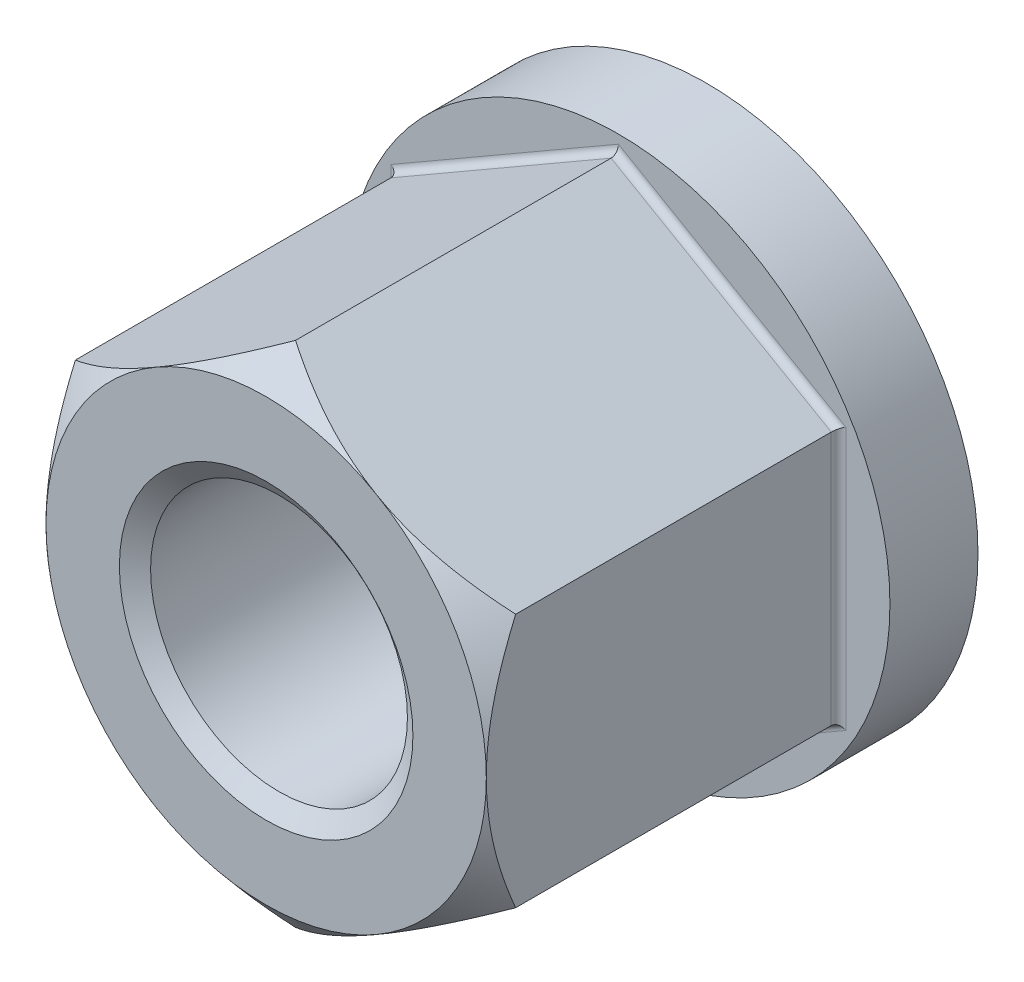
ISO-10303-21;
HEADER;
FILE_DESCRIPTION(('STEP AP214'),'2;1');
FILE_NAME('part.step','',(''),(''),'','','');
FILE_SCHEMA(('AUTOMOTIVE_DESIGN { 1 0 10303 214 1 1 1 1 }'));
ENDSEC;
DATA;
#1=APPLICATION_CONTEXT('core data for automotive mechanical design processes');
#2=APPLICATION_PROTOCOL_DEFINITION('international standard','automotive_design',2000,#1);
#3=PRODUCT_CONTEXT('',#1,'mechanical');
#4=PRODUCT('Part','Part','',(#3));
#5=PRODUCT_RELATED_PRODUCT_CATEGORY('part','',(#4));
#6=PRODUCT_DEFINITION_FORMATION('','',#4);
#7=PRODUCT_DEFINITION_CONTEXT('part definition',#1,'design');
#8=PRODUCT_DEFINITION('design','',#6,#7);
#9=PRODUCT_DEFINITION_SHAPE('','',#8);
#10=(LENGTH_UNIT() NAMED_UNIT(*) SI_UNIT(.MILLI.,.METRE.));
#11=(NAMED_UNIT(*) PLANE_ANGLE_UNIT() SI_UNIT($,.RADIAN.));
#12=(NAMED_UNIT(*) SI_UNIT($,.STERADIAN.) SOLID_ANGLE_UNIT());
#13=UNCERTAINTY_MEASURE_WITH_UNIT(LENGTH_MEASURE(1.E-05),#10,'distance_accuracy_value','');
#14=(GEOMETRIC_REPRESENTATION_CONTEXT(3) GLOBAL_UNCERTAINTY_ASSIGNED_CONTEXT((#13)) GLOBAL_UNIT_ASSIGNED_CONTEXT((#10,
#11,#12)) REPRESENTATION_CONTEXT('',''));
#15=CARTESIAN_POINT('',(0.,0.,0.));
#16=DIRECTION('',(0.,0.,1.));
#17=DIRECTION('',(1.,0.,0.));
#18=AXIS2_PLACEMENT_3D('',#15,#16,#17);
#19=CARTESIAN_POINT('',(0.,0.,-30.));
#20=DIRECTION('',(0.,0.,1.));
#21=DIRECTION('',(1.,0.,0.));
#22=AXIS2_PLACEMENT_3D('',#19,#20,#21);
#23=CYLINDRICAL_SURFACE('',#22,8.75);
#24=CARTESIAN_POINT('',(0.,0.,-0.875259422762136));
#25=DIRECTION('',(0.,0.,1.));
#26=DIRECTION('',(1.,0.,0.));
#27=AXIS2_PLACEMENT_3D('',#24,#25,#26);
#28=CIRCLE('',#27,8.75);
#29=CARTESIAN_POINT('',(8.75,0.,-0.875259422762136));
#30=VERTEX_POINT('',#29);
#31=EDGE_CURVE('E311',#30,#30,#28,.F.);
#32=ORIENTED_EDGE('',*,*,#31,.F.);
#33=EDGE_LOOP('',(#32));
#34=FACE_BOUND('',#33,.T.);
#35=CARTESIAN_POINT('',(0.,0.,-29.0993405772379));
#36=DIRECTION('',(0.,0.,-1.));
#37=DIRECTION('',(-1.,0.,0.));
#38=AXIS2_PLACEMENT_3D('',#35,#36,#37);
#39=CIRCLE('',#38,8.75);
#40=CARTESIAN_POINT('',(-8.75,0.,-29.0993405772379));
#41=VERTEX_POINT('',#40);
#42=EDGE_CURVE('E315',#41,#41,#39,.F.);
#43=ORIENTED_EDGE('',*,*,#42,.F.);
#44=EDGE_LOOP('',(#43));
#45=FACE_BOUND('',#44,.T.);
#46=ADVANCED_FACE('F36',(#34,#45),#23,.F.);
#47=CARTESIAN_POINT('',(0.,17.3205080756888,-30.));
#48=DIRECTION('',(-0.500000000000001,0.866025403784438,0.));
#49=DIRECTION('',(-0.866025403784438,-0.500000000000001,0.));
#50=AXIS2_PLACEMENT_3D('',#47,#48,#49);
#51=PLANE('',#50);
#52=DIRECTION('',(0.,0.,1.));
#53=VECTOR('',#52,1.);
#54=CARTESIAN_POINT('',(0.,17.3205080756888,-30.));
#55=LINE('',#54,#53);
#56=CARTESIAN_POINT('',(0.,17.3205080756888,-23.5));
#57=VERTEX_POINT('',#56);
#58=CARTESIAN_POINT('',(0.,17.3205080756888,-2.));
#59=VERTEX_POINT('',#58);
#60=EDGE_CURVE('E136',#57,#59,#55,.T.);
#61=ORIENTED_EDGE('',*,*,#60,.F.);
#62=DIRECTION('',(-0.866025403784438,-0.500000000000001,0.));
#63=VECTOR('',#62,1.);
#64=CARTESIAN_POINT('',(0.,17.3205080756888,-23.5));
#65=LINE('',#64,#63);
#66=CARTESIAN_POINT('',(-15.,8.66025403784438,-23.5));
#67=VERTEX_POINT('',#66);
#68=EDGE_CURVE('E291',#57,#67,#65,.T.);
#69=ORIENTED_EDGE('',*,*,#68,.T.);
#70=DIRECTION('',(0.,0.,1.));
#71=VECTOR('',#70,1.);
#72=CARTESIAN_POINT('',(-15.,8.66025403784438,-30.));
#73=LINE('',#72,#71);
#74=CARTESIAN_POINT('',(-15.,8.66025403784438,-1.99999999999999));
#75=VERTEX_POINT('',#74);
#76=EDGE_CURVE('E397',#67,#75,#73,.T.);
#77=ORIENTED_EDGE('',*,*,#76,.T.);
#78=CARTESIAN_POINT('',(-15.0002,8.66013856779054,-2.00009952235006));
#79=CARTESIAN_POINT('',(-14.7060757976467,8.82995125519442,-1.85376357380572));
#80=CARTESIAN_POINT('',(-14.4098812995456,9.00095922840558,-1.71280448699444));
#81=CARTESIAN_POINT('',(-13.8130701074498,9.34552833081745,-1.44337970687907));
#82=CARTESIAN_POINT('',(-13.5124509184251,9.51909090052444,-1.31492139968357));
#83=CARTESIAN_POINT('',(-12.9053171881535,9.86961972313082,-1.07179862141888));
#84=CARTESIAN_POINT('',(-12.5987804698595,10.0465987799544,-0.95720746667837));
#85=CARTESIAN_POINT('',(-11.9814441021399,10.4030180980378,-0.744650765460598));
#86=CARTESIAN_POINT('',(-11.6706451758392,10.5824579418014,-0.646682435571173));
#87=CARTESIAN_POINT('',(-11.0506469286094,10.9404140967366,-0.471023182345309));
#88=CARTESIAN_POINT('',(-10.7415185231247,11.1188894648574,-0.393000744560478));
#89=CARTESIAN_POINT('',(-10.1199547642437,11.4777494683658,-0.25686594504551));
#90=CARTESIAN_POINT('',(-9.80751931264454,11.658134160451,-0.198754176283631));
#91=CARTESIAN_POINT('',(-9.18088543175198,12.0199214002677,-0.104143857271192));
#92=CARTESIAN_POINT('',(-8.86669240865014,12.201320826733,-0.0675979340687058));
#93=CARTESIAN_POINT('',(-8.23695394550474,12.5649004979491,-0.0170214367027407));
#94=CARTESIAN_POINT('',(-7.9214086044632,12.7470806855409,-0.00298924163594202));
#95=CARTESIAN_POINT('',(-7.33426455441391,13.08606846089,0.00177413708507495));
#96=CARTESIAN_POINT('',(-7.06268097278657,13.24286731485,-0.00451502163640773));
#97=CARTESIAN_POINT('',(-6.52020787540679,13.5560643036503,-0.0339193309163509));
#98=CARTESIAN_POINT('',(-6.24931833664911,13.7124624517727,-0.0570339163329606));
#99=CARTESIAN_POINT('',(-5.70876115134929,14.024553288218,-0.119589923967057));
#100=CARTESIAN_POINT('',(-5.43909455801071,14.1802453684735,-0.159043422054258));
#101=CARTESIAN_POINT('',(-4.90182180864681,14.490439934947,-0.253419775039468));
#102=CARTESIAN_POINT('',(-4.63421568232431,14.644942404016,-0.308342852513073));
#103=CARTESIAN_POINT('',(-3.83513389890789,15.106292486776,-0.49476628021808));
#104=CARTESIAN_POINT('',(-3.30738818721074,15.4109866154881,-0.647921641084802));
#105=CARTESIAN_POINT('',(-2.26451509299679,16.0130896771631,-1.00192343949661));
#106=CARTESIAN_POINT('',(-1.74938365522976,16.3105009514259,-1.2027543221892));
#107=CARTESIAN_POINT('',(-1.03142392231063,16.7250151964941,-1.51292629823482));
#108=CARTESIAN_POINT('',(-0.823357044658433,16.8451426643161,-1.60648338502438));
#109=CARTESIAN_POINT('',(-0.409806250301163,17.0839063267618,-1.79919445620714));
#110=CARTESIAN_POINT('',(-0.204317005560418,17.2025455975285,-1.89833317959749));
#111=CARTESIAN_POINT('',(0.000200000000003288,17.3206235457426,-2.00009952235005));
#112=B_SPLINE_CURVE_WITH_KNOTS('',3,(#78,#79,#80,#81,#82,#83,#84,#85,#86,#87,#88,#89,#90,#91,
#92,#93,#94,#95,#96,#97,#98,#99,#100,#101,#102,#103,#104,#105,#106,#107,#108,#109,#110,#111),
.UNSPECIFIED.,.F.,.F.,(4,2,2,2,2,2,2,2,2,2,2,2,2,2,2,2,4),(0.,1.10948507069864,2.21962175239093,
3.33539267821336,4.45097658878426,5.54659561152164,6.64224726052818,7.73548308250292,
8.82864019209861,9.7691757573931,10.7096797329101,11.6508800662861,12.592093942301,
14.4744986262021,16.3562899894552,17.1297186672474,17.9011266906692),.UNSPECIFIED.);
#113=CARTESIAN_POINT('',(-7.50000000000001,12.9903810567666,0.));
#114=VERTEX_POINT('',#113);
#115=EDGE_CURVE('E146',#75,#114,#112,.T.);
#116=ORIENTED_EDGE('',*,*,#115,.T.);
#117=EDGE_CURVE('E154',#114,#59,#112,.T.);
#118=ORIENTED_EDGE('',*,*,#117,.T.);
#119=EDGE_LOOP('',(#61,#69,#77,#116,#118));
#120=FACE_BOUND('',#119,.T.);
#121=ADVANCED_FACE('F225',(#120),#51,.T.);
#122=CARTESIAN_POINT('',(15.,8.66025403784439,-30.));
#123=DIRECTION('',(0.5,0.866025403784438,0.));
#124=DIRECTION('',(-0.866025403784439,0.5,0.));
#125=AXIS2_PLACEMENT_3D('',#122,#123,#124);
#126=PLANE('',#125);
#127=DIRECTION('',(0.,0.,1.));
#128=VECTOR('',#127,1.);
#129=CARTESIAN_POINT('',(15.,8.66025403784439,-30.));
#130=LINE('',#129,#128);
#131=CARTESIAN_POINT('',(15.,8.66025403784439,-23.5));
#132=VERTEX_POINT('',#131);
#133=CARTESIAN_POINT('',(15.,8.6602540378444,-2.));
#134=VERTEX_POINT('',#133);
#135=EDGE_CURVE('E125',#132,#134,#130,.T.);
#136=ORIENTED_EDGE('',*,*,#135,.F.);
#137=DIRECTION('',(-0.866025403784439,0.5,0.));
#138=VECTOR('',#137,1.);
#139=CARTESIAN_POINT('',(15.,8.66025403784439,-23.5));
#140=LINE('',#139,#138);
#141=EDGE_CURVE('E344',#132,#57,#140,.T.);
#142=ORIENTED_EDGE('',*,*,#141,.T.);
#143=ORIENTED_EDGE('',*,*,#60,.T.);
#144=CARTESIAN_POINT('',(-0.00020000000000316,17.3206235457426,-2.00009952235007));
#145=CARTESIAN_POINT('',(0.293924202353319,17.1508108583387,-1.85376357380573));
#146=CARTESIAN_POINT('',(0.590118700454435,16.9798028851276,-1.71280448699445));
#147=CARTESIAN_POINT('',(1.18692989255019,16.6352337827157,-1.44337970687908));
#148=CARTESIAN_POINT('',(1.48754908157492,16.4616712130087,-1.31492139968358));
#149=CARTESIAN_POINT('',(2.09468281184647,16.1111423904023,-1.07179862141888));
#150=CARTESIAN_POINT('',(2.40121953014046,15.9341633335788,-0.957207466678374));
#151=CARTESIAN_POINT('',(3.0185558978601,15.5777440154953,-0.744650765460601));
#152=CARTESIAN_POINT('',(3.32935482416082,15.3983041717318,-0.646682435571175));
#153=CARTESIAN_POINT('',(3.94935307139059,15.0403480167965,-0.471023182345312));
#154=CARTESIAN_POINT('',(4.25848147687533,14.8618726486758,-0.393000744560482));
#155=CARTESIAN_POINT('',(4.88004523575629,14.5030126451673,-0.256865945045512));
#156=CARTESIAN_POINT('',(5.19248068735547,14.3226279530822,-0.198754176283632));
#157=CARTESIAN_POINT('',(5.81911456824804,13.9608407132655,-0.104143857271192));
#158=CARTESIAN_POINT('',(6.13330759134988,13.7794412868002,-0.0675979340687059));
#159=CARTESIAN_POINT('',(6.76304605449528,13.4158616155841,-0.0170214367027422));
#160=CARTESIAN_POINT('',(7.07859139553682,13.2336814279922,-0.00298924163594429));
#161=CARTESIAN_POINT('',(7.66573544558611,12.8946936526432,0.00177413708507411));
#162=CARTESIAN_POINT('',(7.93731902721345,12.7378947986832,-0.00451502163640669));
#163=CARTESIAN_POINT('',(8.47979212459323,12.4246978098828,-0.0339193309163505));
#164=CARTESIAN_POINT('',(8.75068166335091,12.2682996617604,-0.0570339163329628));
#165=CARTESIAN_POINT('',(9.29123884865073,11.9562088253152,-0.11958992396706));
#166=CARTESIAN_POINT('',(9.56090544198932,11.8005167450597,-0.159043422054259));
#167=CARTESIAN_POINT('',(10.0981781913532,11.4903221785862,-0.253419775039469));
#168=CARTESIAN_POINT('',(10.3657843176757,11.3358197095171,-0.308342852513076));
#169=CARTESIAN_POINT('',(11.1648661010921,10.8744696267571,-0.494766280218087));
#170=CARTESIAN_POINT('',(11.6926118127893,10.5697754980451,-0.647921641084808));
#171=CARTESIAN_POINT('',(12.7354849070032,9.96767243637004,-1.00192343949662));
#172=CARTESIAN_POINT('',(13.2506163447703,9.67026116210721,-1.20275432218921));
#173=CARTESIAN_POINT('',(13.9685760776894,9.25574691703904,-1.51292629823483));
#174=CARTESIAN_POINT('',(14.1766429553416,9.1356194492171,-1.60648338502438));
#175=CARTESIAN_POINT('',(14.5901937496988,8.89685578677135,-1.79919445620714));
#176=CARTESIAN_POINT('',(14.7956829944396,8.77821651600471,-1.89833317959748));
#177=CARTESIAN_POINT('',(15.0002,8.66013856779055,-2.00009952235005));
#178=B_SPLINE_CURVE_WITH_KNOTS('',3,(#144,#145,#146,#147,#148,#149,#150,#151,#152,#153,#154,
#155,#156,#157,#158,#159,#160,#161,#162,#163,#164,#165,#166,#167,#168,#169,#170,#171,#172,#173,
#174,#175,#176,#177),.UNSPECIFIED.,.F.,.F.,(4,2,2,2,2,2,2,2,2,2,2,2,2,2,2,2,4),(0.,
1.10948507069864,2.21962175239093,3.33539267821337,4.45097658878428,5.54659561152165,
6.6422472605282,7.73548308250295,8.82864019209864,9.76917575739312,10.7096797329102,
11.6508800662862,12.592093942301,14.4744986262022,16.3562899894552,17.1297186672474,
17.9011266906692),.UNSPECIFIED.);
#179=CARTESIAN_POINT('',(7.50000000000001,12.9903810567666,0.));
#180=VERTEX_POINT('',#179);
#181=EDGE_CURVE('E152',#59,#180,#178,.T.);
#182=ORIENTED_EDGE('',*,*,#181,.T.);
#183=EDGE_CURVE('E141',#180,#134,#178,.T.);
#184=ORIENTED_EDGE('',*,*,#183,.T.);
#185=EDGE_LOOP('',(#136,#142,#143,#182,#184));
#186=FACE_BOUND('',#185,.T.);
#187=ADVANCED_FACE('F150',(#186),#126,.T.);
#188=CARTESIAN_POINT('',(15.,8.66025403784439,-30.));
#189=DIRECTION('',(-1.,0.,0.));
#190=DIRECTION('',(0.,0.,1.));
#191=AXIS2_PLACEMENT_3D('',#188,#189,#190);
#192=PLANE('',#191);
#193=DIRECTION('',(0.,0.,1.));
#194=VECTOR('',#193,1.);
#195=CARTESIAN_POINT('',(15.,-8.66025403784439,-30.));
#196=LINE('',#195,#194);
#197=CARTESIAN_POINT('',(15.,-8.66025403784439,-23.5));
#198=VERTEX_POINT('',#197);
#199=CARTESIAN_POINT('',(15.,-8.66025403784439,-2.));
#200=VERTEX_POINT('',#199);
#201=EDGE_CURVE('E137',#198,#200,#196,.T.);
#202=ORIENTED_EDGE('',*,*,#201,.F.);
#203=DIRECTION('',(0.,-1.,0.));
#204=VECTOR('',#203,1.);
#205=CARTESIAN_POINT('',(15.,8.66025403784439,-23.5));
#206=LINE('',#205,#204);
#207=EDGE_CURVE('E132',#198,#132,#206,.F.);
#208=ORIENTED_EDGE('',*,*,#207,.T.);
#209=ORIENTED_EDGE('',*,*,#135,.T.);
#210=CARTESIAN_POINT('',(15.,-19.1700059350074,-8.05090889611689));
#211=CARTESIAN_POINT('',(15.,-18.9275206354568,-7.88631767771326));
#212=CARTESIAN_POINT('',(15.,-18.6844874388706,-7.72253420345206));
#213=CARTESIAN_POINT('',(15.,-18.1972287099045,-7.39674277064008));
#214=CARTESIAN_POINT('',(15.,-17.9530031591107,-7.23473483963597));
#215=CARTESIAN_POINT('',(15.,-17.2183033754217,-6.75155555270782));
#216=CARTESIAN_POINT('',(15.,-16.7259060298545,-6.43329677874288));
#217=CARTESIAN_POINT('',(15.,-15.7316332205885,-5.80395780434216));
#218=CARTESIAN_POINT('',(15.,-15.2297153036346,-5.49294452298561));
#219=CARTESIAN_POINT('',(15.,-14.2188386651143,-4.88261437731177));
#220=CARTESIAN_POINT('',(15.,-13.7098803898837,-4.58329677608631));
#221=CARTESIAN_POINT('',(15.,-12.6558737691412,-3.98324168268048));
#222=CARTESIAN_POINT('',(15.,-12.1103654113884,-3.68330803620537));
#223=CARTESIAN_POINT('',(15.,-11.0085509125241,-3.10364215180241));
#224=CARTESIAN_POINT('',(15.,-10.4522432037346,-2.82391287507046));
#225=CARTESIAN_POINT('',(15.,-9.32882395666249,-2.29094315775273));
#226=CARTESIAN_POINT('',(15.,-8.76174593243296,-2.03763271569057));
#227=CARTESIAN_POINT('',(15.,-7.61420990037534,-1.5637598276153));
#228=CARTESIAN_POINT('',(15.,-7.03375753033514,-1.34318386434149));
#229=CARTESIAN_POINT('',(15.,-5.87502682424205,-0.948900988874816));
#230=CARTESIAN_POINT('',(15.,-5.29714569425346,-0.774051264481811));
#231=CARTESIAN_POINT('',(15.,-4.42105396009466,-0.547701421247556));
#232=CARTESIAN_POINT('',(15.,-4.12743813987391,-0.478231983515909));
#233=CARTESIAN_POINT('',(15.,-3.53743452890364,-0.352355791219994));
#234=CARTESIAN_POINT('',(15.,-3.241047120842,-0.295947260184663));
#235=CARTESIAN_POINT('',(15.,-2.65145129592594,-0.198095868457253));
#236=CARTESIAN_POINT('',(15.,-2.35828586612642,-0.156394854813077));
#237=CARTESIAN_POINT('',(15.,-1.77026502501334,-0.0873015611666262));
#238=CARTESIAN_POINT('',(15.,-1.47540962715372,-0.059909167411891));
#239=CARTESIAN_POINT('',(15.,-0.8847145680178,-0.019981298888571));
#240=CARTESIAN_POINT('',(15.,-0.588874992642845,-0.00744455992000842));
#241=CARTESIAN_POINT('',(15.,0.00305761451050969,0.00251533349846376));
#242=CARTESIAN_POINT('',(15.,0.299150642562203,-6.12935193820835E-05));
#243=CARTESIAN_POINT('',(15.,0.871019721411166,-0.0195951804328308));
#244=CARTESIAN_POINT('',(15.,1.1468296728535,-0.0355787614535354));
#245=CARTESIAN_POINT('',(15.,1.69743098913966,-0.0803688454583632));
#246=CARTESIAN_POINT('',(15.,1.97222224292503,-0.109176707364896));
#247=CARTESIAN_POINT('',(15.,2.52020530468539,-0.17912243801867));
#248=CARTESIAN_POINT('',(15.,2.79339723606099,-0.220259342348629));
#249=CARTESIAN_POINT('',(15.,3.33777776420506,-0.31420359695824));
#250=CARTESIAN_POINT('',(15.,3.60896609343915,-0.367012477660287));
#251=CARTESIAN_POINT('',(15.,4.43016208456759,-0.544224168870411));
#252=CARTESIAN_POINT('',(15.,4.97652212658976,-0.685926010872227));
#253=CARTESIAN_POINT('',(15.,5.78718186080952,-0.927093948765585));
#254=CARTESIAN_POINT('',(15.,6.05591252895641,-1.01224899932063));
#255=CARTESIAN_POINT('',(15.,6.59047935461385,-1.19122104168167));
#256=CARTESIAN_POINT('',(15.,6.85631559032146,-1.2850377988274));
#257=CARTESIAN_POINT('',(15.,7.60466136813906,-1.56163041477181));
#258=CARTESIAN_POINT('',(15.,8.08378529907564,-1.75358524293515));
#259=CARTESIAN_POINT('',(15.,9.03291639131406,-2.15897509786146));
#260=CARTESIAN_POINT('',(15.,9.50292094886758,-2.37241615474783));
#261=CARTESIAN_POINT('',(15.,10.435035222969,-2.8170801317684));
#262=CARTESIAN_POINT('',(15.,10.8971356874867,-3.04832235174882));
#263=CARTESIAN_POINT('',(15.,11.8137759437364,-3.52517366349231));
#264=CARTESIAN_POINT('',(15.,12.2683163766357,-3.77078152884087));
#265=CARTESIAN_POINT('',(15.,13.1735034135425,-4.2753519445037));
#266=CARTESIAN_POINT('',(15.,13.624109897057,-4.53438621842229));
#267=CARTESIAN_POINT('',(15.,14.5194712634897,-5.06236644462512));
#268=CARTESIAN_POINT('',(15.,14.9642260429993,-5.33131257174866));
#269=CARTESIAN_POINT('',(15.,15.8483804209955,-5.87730627266098));
#270=CARTESIAN_POINT('',(15.,16.2877828704418,-6.15434923994196));
#271=CARTESIAN_POINT('',(15.,17.1621286796864,-6.71536083077432));
#272=CARTESIAN_POINT('',(15.,17.597072077789,-6.99932939476223));
#273=CARTESIAN_POINT('',(15.,18.8105434643133,-7.80331547355916));
#274=CARTESIAN_POINT('',(15.,19.5847195402707,-8.32990192265516));
#275=CARTESIAN_POINT('',(15.,21.1232503196596,-9.39738828495241));
#276=CARTESIAN_POINT('',(15.,21.887603619625,-9.93829021048408));
#277=CARTESIAN_POINT('',(15.,23.3983470976215,-11.0238654907992));
#278=CARTESIAN_POINT('',(15.,24.1448411676302,-11.568394489411));
#279=CARTESIAN_POINT('',(15.,25.2598036920299,-12.3914414497286));
#280=CARTESIAN_POINT('',(15.,25.6306142866812,-12.6667970407769));
#281=CARTESIAN_POINT('',(15.,26.3708177650263,-13.2193998836579));
#282=CARTESIAN_POINT('',(15.,26.7402106628407,-13.4966471165723));
#283=CARTESIAN_POINT('',(15.,27.1089697385117,-13.7747353492357));
#284=B_SPLINE_CURVE_WITH_KNOTS('',3,(#210,#211,#212,#213,#214,#215,#216,#217,#218,#219,#220,
#221,#222,#223,#224,#225,#226,#227,#228,#229,#230,#231,#232,#233,#234,#235,#236,#237,#238,#239,
#240,#241,#242,#243,#244,#245,#246,#247,#248,#249,#250,#251,#252,#253,#254,#255,#256,#257,#258,
#259,#260,#261,#262,#263,#264,#265,#266,#267,#268,#269,#270,#271,#272,#273,#274,#275,#276,#277,
#278,#279,#280,#281,#282,#283),.UNSPECIFIED.,.F.,.F.,(4,2,2,2,2,2,2,2,2,2,2,2,2,2,2,2,2,2,2,2,2,
2,2,2,2,2,2,2,2,2,2,2,2,2,2,2,4),(0.,0.879203745196034,1.75842111155174,3.51721877017545,
5.28849002407527,7.05964949517006,8.926892336207,10.7944082913819,12.6568430031059,
14.5185064947588,16.3278593564779,17.2327799755418,18.137577439996,19.0255944198823,
19.9136043399924,20.8015386860011,21.6894601929238,22.517974772915,23.3465771671968,
24.1751147624484,25.003761059558,26.6950771653709,27.5406764233947,28.3862527794239,
29.9339956822136,31.4821741774755,33.0320554956247,34.5818046908974,36.1409175753303,
37.7000579747798,39.2583279729673,40.8165845740081,43.6252202356825,46.4342528272958,
49.2061553997078,50.591752078976,51.9773349212113),.UNSPECIFIED.);
#285=CARTESIAN_POINT('',(15.,0.,0.));
#286=VERTEX_POINT('',#285);
#287=EDGE_CURVE('E130',#286,#134,#284,.T.);
#288=ORIENTED_EDGE('',*,*,#287,.F.);
#289=EDGE_CURVE('E148',#200,#286,#284,.T.);
#290=ORIENTED_EDGE('',*,*,#289,.F.);
#291=EDGE_LOOP('',(#202,#208,#209,#288,#290));
#292=FACE_BOUND('',#291,.T.);
#293=ADVANCED_FACE('F128',(#292),#192,.F.);
#294=CARTESIAN_POINT('',(0.,-17.3205080756888,-30.));
#295=DIRECTION('',(0.500000000000001,-0.866025403784438,0.));
#296=DIRECTION('',(0.866025403784438,0.500000000000001,0.));
#297=AXIS2_PLACEMENT_3D('',#294,#295,#296);
#298=PLANE('',#297);
#299=DIRECTION('',(0.,0.,1.));
#300=VECTOR('',#299,1.);
#301=CARTESIAN_POINT('',(0.,-17.3205080756888,-30.));
#302=LINE('',#301,#300);
#303=CARTESIAN_POINT('',(0.,-17.3205080756888,-23.5));
#304=VERTEX_POINT('',#303);
#305=CARTESIAN_POINT('',(0.,-17.3205080756888,-2.));
#306=VERTEX_POINT('',#305);
#307=EDGE_CURVE('E306',#304,#306,#302,.T.);
#308=ORIENTED_EDGE('',*,*,#307,.F.);
#309=DIRECTION('',(0.866025403784438,0.500000000000001,0.));
#310=VECTOR('',#309,1.);
#311=CARTESIAN_POINT('',(0.,-17.3205080756888,-23.5));
#312=LINE('',#311,#310);
#313=EDGE_CURVE('E341',#304,#198,#312,.T.);
#314=ORIENTED_EDGE('',*,*,#313,.T.);
#315=ORIENTED_EDGE('',*,*,#201,.T.);
#316=CARTESIAN_POINT('',(15.0002,-8.66013856779056,-2.00009952235007));
#317=CARTESIAN_POINT('',(14.7060757976467,-8.82995125519443,-1.85376357380573));
#318=CARTESIAN_POINT('',(14.4098812995456,-9.00095922840559,-1.71280448699445));
#319=CARTESIAN_POINT('',(13.8130701074498,-9.34552833081746,-1.44337970687908));
#320=CARTESIAN_POINT('',(13.5124509184251,-9.51909090052446,-1.31492139968358));
#321=CARTESIAN_POINT('',(12.9053171881535,-9.86961972313083,-1.07179862141889));
#322=CARTESIAN_POINT('',(12.5987804698596,-10.0465987799544,-0.957207466678381));
#323=CARTESIAN_POINT('',(11.9814441021399,-10.4030180980379,-0.744650765460608));
#324=CARTESIAN_POINT('',(11.6706451758392,-10.5824579418014,-0.646682435571182));
#325=CARTESIAN_POINT('',(11.0506469286094,-10.9404140967366,-0.471023182345318));
#326=CARTESIAN_POINT('',(10.7415185231247,-11.1188894648574,-0.393000744560489));
#327=CARTESIAN_POINT('',(10.1199547642437,-11.4777494683658,-0.256865945045522));
#328=CARTESIAN_POINT('',(9.80751931264455,-11.658134160451,-0.198754176283643));
#329=CARTESIAN_POINT('',(9.18088543175198,-12.0199214002677,-0.104143857271203));
#330=CARTESIAN_POINT('',(8.86669240865015,-12.201320826733,-0.067597934068717));
#331=CARTESIAN_POINT('',(8.23695394550474,-12.5649004979491,-0.0170214367027534));
#332=CARTESIAN_POINT('',(7.9214086044632,-12.7470806855409,-0.00298924163595622));
#333=CARTESIAN_POINT('',(7.33426455441392,-13.08606846089,0.00177413708506144));
#334=CARTESIAN_POINT('',(7.06268097278658,-13.24286731485,-0.00451502163641958));
#335=CARTESIAN_POINT('',(6.52020787540679,-13.5560643036504,-0.0339193309163629));
#336=CARTESIAN_POINT('',(6.24931833664912,-13.7124624517728,-0.0570339163329745));
#337=CARTESIAN_POINT('',(5.7087611513493,-14.024553288218,-0.119589923967071));
#338=CARTESIAN_POINT('',(5.43909455801071,-14.1802453684735,-0.159043422054269));
#339=CARTESIAN_POINT('',(4.90182180864681,-14.490439934947,-0.25341977503948));
#340=CARTESIAN_POINT('',(4.63421568232432,-14.6449424040161,-0.308342852513087));
#341=CARTESIAN_POINT('',(3.8351338989079,-15.1062924867761,-0.494766280218097));
#342=CARTESIAN_POINT('',(3.30738818721075,-15.4109866154881,-0.647921641084818));
#343=CARTESIAN_POINT('',(2.2645150929968,-16.0130896771631,-1.00192343949662));
#344=CARTESIAN_POINT('',(1.74938365522976,-16.310500951426,-1.20275432218922));
#345=CARTESIAN_POINT('',(1.03142392231063,-16.7250151964941,-1.51292629823484));
#346=CARTESIAN_POINT('',(0.823357044658436,-16.8451426643161,-1.60648338502439));
#347=CARTESIAN_POINT('',(0.409806250301165,-17.0839063267618,-1.79919445620716));
#348=CARTESIAN_POINT('',(0.204317005560418,-17.2025455975285,-1.89833317959751));
#349=CARTESIAN_POINT('',(-0.00020000000000472,-17.3206235457426,-2.00009952235007));
#350=B_SPLINE_CURVE_WITH_KNOTS('',3,(#316,#317,#318,#319,#320,#321,#322,#323,#324,#325,#326,
#327,#328,#329,#330,#331,#332,#333,#334,#335,#336,#337,#338,#339,#340,#341,#342,#343,#344,#345,
#346,#347,#348,#349),.UNSPECIFIED.,.F.,.F.,(4,2,2,2,2,2,2,2,2,2,2,2,2,2,2,2,4),(0.,
1.10948507069863,2.21962175239092,3.33539267821335,4.45097658878426,5.54659561152163,
6.64224726052817,7.73548308250292,8.82864019209861,9.76917575739309,10.7096797329101,
11.6508800662861,12.592093942301,14.4744986262021,16.3562899894552,17.1297186672474,
17.9011266906692),.UNSPECIFIED.);
#351=CARTESIAN_POINT('',(7.50000000000002,-12.9903810567666,0.));
#352=VERTEX_POINT('',#351);
#353=EDGE_CURVE('E211',#200,#352,#350,.T.);
#354=ORIENTED_EDGE('',*,*,#353,.T.);
#355=EDGE_CURVE('E203',#352,#306,#350,.T.);
#356=ORIENTED_EDGE('',*,*,#355,.T.);
#357=EDGE_LOOP('',(#308,#314,#315,#354,#356));
#358=FACE_BOUND('',#357,.T.);
#359=ADVANCED_FACE('F214',(#358),#298,.T.);
#360=CARTESIAN_POINT('',(-15.,-8.6602540378444,-30.));
#361=DIRECTION('',(-0.500000000000001,-0.866025403784438,0.));
#362=DIRECTION('',(0.866025403784438,-0.500000000000001,0.));
#363=AXIS2_PLACEMENT_3D('',#360,#361,#362);
#364=PLANE('',#363);
#365=DIRECTION('',(0.,0.,1.));
#366=VECTOR('',#365,1.);
#367=CARTESIAN_POINT('',(-15.,-8.6602540378444,-30.));
#368=LINE('',#367,#366);
#369=CARTESIAN_POINT('',(-15.,-8.6602540378444,-23.5));
#370=VERTEX_POINT('',#369);
#371=CARTESIAN_POINT('',(-15.,-8.6602540378444,-2.));
#372=VERTEX_POINT('',#371);
#373=EDGE_CURVE('E400',#370,#372,#368,.T.);
#374=ORIENTED_EDGE('',*,*,#373,.F.);
#375=DIRECTION('',(0.866025403784438,-0.500000000000001,0.));
#376=VECTOR('',#375,1.);
#377=CARTESIAN_POINT('',(-15.,-8.6602540378444,-23.5));
#378=LINE('',#377,#376);
#379=EDGE_CURVE('E45',#370,#304,#378,.T.);
#380=ORIENTED_EDGE('',*,*,#379,.T.);
#381=ORIENTED_EDGE('',*,*,#307,.T.);
#382=CARTESIAN_POINT('',(0.000200000000001502,-17.3206235457426,-2.00009952235009));
#383=CARTESIAN_POINT('',(-0.293924202353319,-17.1508108583388,-1.85376357380575));
#384=CARTESIAN_POINT('',(-0.590118700454435,-16.9798028851276,-1.71280448699447));
#385=CARTESIAN_POINT('',(-1.18692989255019,-16.6352337827157,-1.4433797068791));
#386=CARTESIAN_POINT('',(-1.48754908157492,-16.4616712130087,-1.3149213996836));
#387=CARTESIAN_POINT('',(-2.09468281184647,-16.1111423904024,-1.0717986214189));
#388=CARTESIAN_POINT('',(-2.40121953014046,-15.9341633335788,-0.957207466678391));
#389=CARTESIAN_POINT('',(-3.0185558978601,-15.5777440154953,-0.744650765460618));
#390=CARTESIAN_POINT('',(-3.32935482416082,-15.3983041717318,-0.646682435571191));
#391=CARTESIAN_POINT('',(-3.94935307139059,-15.0403480167966,-0.471023182345327));
#392=CARTESIAN_POINT('',(-4.25848147687533,-14.8618726486758,-0.393000744560496));
#393=CARTESIAN_POINT('',(-4.88004523575629,-14.5030126451673,-0.256865945045526));
#394=CARTESIAN_POINT('',(-5.19248068735548,-14.3226279530822,-0.198754176283645));
#395=CARTESIAN_POINT('',(-5.81911456824804,-13.9608407132655,-0.104143857271205));
#396=CARTESIAN_POINT('',(-6.13330759134988,-13.7794412868002,-0.0675979340687199));
#397=CARTESIAN_POINT('',(-6.76304605449529,-13.4158616155841,-0.0170214367027566));
#398=CARTESIAN_POINT('',(-7.07859139553683,-13.2336814279922,-0.00298924163595856));
#399=CARTESIAN_POINT('',(-7.66573544558612,-12.8946936526432,0.00177413708506067));
#400=CARTESIAN_POINT('',(-7.93731902721346,-12.7378947986832,-0.00451502163641957));
#401=CARTESIAN_POINT('',(-8.47979212459325,-12.4246978098828,-0.0339193309163623));
#402=CARTESIAN_POINT('',(-8.75068166335092,-12.2682996617604,-0.057033916332974));
#403=CARTESIAN_POINT('',(-9.29123884865075,-11.9562088253152,-0.119589923967072));
#404=CARTESIAN_POINT('',(-9.56090544198933,-11.8005167450597,-0.159043422054272));
#405=CARTESIAN_POINT('',(-10.0981781913532,-11.4903221785862,-0.253419775039483));
#406=CARTESIAN_POINT('',(-10.3657843176757,-11.3358197095171,-0.30834285251309));
#407=CARTESIAN_POINT('',(-11.1648661010922,-10.8744696267571,-0.494766280218099));
#408=CARTESIAN_POINT('',(-11.6926118127893,-10.5697754980451,-0.647921641084822));
#409=CARTESIAN_POINT('',(-12.7354849070033,-9.96767243637004,-1.00192343949663));
#410=CARTESIAN_POINT('',(-13.2506163447703,-9.6702611621072,-1.20275432218922));
#411=CARTESIAN_POINT('',(-13.9685760776894,-9.25574691703904,-1.51292629823484));
#412=CARTESIAN_POINT('',(-14.1766429553416,-9.1356194492171,-1.60648338502439));
#413=CARTESIAN_POINT('',(-14.5901937496989,-8.89685578677135,-1.79919445620715));
#414=CARTESIAN_POINT('',(-14.7956829944396,-8.77821651600472,-1.89833317959749));
#415=CARTESIAN_POINT('',(-15.0002,-8.66013856779056,-2.00009952235005));
#416=B_SPLINE_CURVE_WITH_KNOTS('',3,(#382,#383,#384,#385,#386,#387,#388,#389,#390,#391,#392,
#393,#394,#395,#396,#397,#398,#399,#400,#401,#402,#403,#404,#405,#406,#407,#408,#409,#410,#411,
#412,#413,#414,#415),.UNSPECIFIED.,.F.,.F.,(4,2,2,2,2,2,2,2,2,2,2,2,2,2,2,2,4),(0.,
1.10948507069864,2.21962175239093,3.33539267821337,4.45097658878428,5.54659561152166,
6.64224726052821,7.73548308250296,8.82864019209865,9.76917575739314,10.7096797329102,
11.6508800662862,12.592093942301,14.4744986262022,16.3562899894552,17.1297186672474,
17.9011266906692),.UNSPECIFIED.);
#417=CARTESIAN_POINT('',(-7.50000000000001,-12.9903810567666,0.));
#418=VERTEX_POINT('',#417);
#419=EDGE_CURVE('E305',#306,#418,#416,.T.);
#420=ORIENTED_EDGE('',*,*,#419,.T.);
#421=EDGE_CURVE('E196',#418,#372,#416,.T.);
#422=ORIENTED_EDGE('',*,*,#421,.T.);
#423=EDGE_LOOP('',(#374,#380,#381,#420,#422));
#424=FACE_BOUND('',#423,.T.);
#425=ADVANCED_FACE('F217',(#424),#364,.T.);
#426=CARTESIAN_POINT('',(-15.,8.66025403784438,-30.));
#427=DIRECTION('',(-1.,0.,0.));
#428=DIRECTION('',(0.,0.,1.));
#429=AXIS2_PLACEMENT_3D('',#426,#427,#428);
#430=PLANE('',#429);
#431=ORIENTED_EDGE('',*,*,#76,.F.);
#432=DIRECTION('',(0.,-1.,0.));
#433=VECTOR('',#432,1.);
#434=CARTESIAN_POINT('',(-15.,8.66025403784438,-23.5));
#435=LINE('',#434,#433);
#436=EDGE_CURVE('E12',#67,#370,#435,.T.);
#437=ORIENTED_EDGE('',*,*,#436,.T.);
#438=ORIENTED_EDGE('',*,*,#373,.T.);
#439=CARTESIAN_POINT('',(-15.,-19.1700059350074,-8.05090889611689));
#440=CARTESIAN_POINT('',(-15.,-18.9275206354568,-7.88631767771326));
#441=CARTESIAN_POINT('',(-15.,-18.6844874388706,-7.72253420345206));
#442=CARTESIAN_POINT('',(-15.,-18.1972287099046,-7.39674277064008));
#443=CARTESIAN_POINT('',(-15.,-17.9530031591107,-7.23473483963597));
#444=CARTESIAN_POINT('',(-15.,-17.2183033754217,-6.75155555270782));
#445=CARTESIAN_POINT('',(-15.,-16.7259060298545,-6.43329677874288));
#446=CARTESIAN_POINT('',(-15.,-15.7316332205885,-5.80395780434216));
#447=CARTESIAN_POINT('',(-15.,-15.2297153036346,-5.49294452298561));
#448=CARTESIAN_POINT('',(-15.,-14.2188386651143,-4.88261437731178));
#449=CARTESIAN_POINT('',(-15.,-13.7098803898838,-4.58329677608631));
#450=CARTESIAN_POINT('',(-15.,-12.6558737691412,-3.98324168268048));
#451=CARTESIAN_POINT('',(-15.,-12.1103654113884,-3.68330803620537));
#452=CARTESIAN_POINT('',(-15.,-11.0085509125241,-3.10364215180242));
#453=CARTESIAN_POINT('',(-15.,-10.4522432037346,-2.82391287507047));
#454=CARTESIAN_POINT('',(-15.,-9.32882395666249,-2.29094315775273));
#455=CARTESIAN_POINT('',(-15.,-8.76174593243297,-2.03763271569057));
#456=CARTESIAN_POINT('',(-15.,-7.61420990037534,-1.5637598276153));
#457=CARTESIAN_POINT('',(-15.,-7.03375753033514,-1.34318386434149));
#458=CARTESIAN_POINT('',(-15.,-5.87502682424205,-0.948900988874819));
#459=CARTESIAN_POINT('',(-15.,-5.29714569425346,-0.774051264481815));
#460=CARTESIAN_POINT('',(-15.,-4.42105396009467,-0.547701421247558));
#461=CARTESIAN_POINT('',(-15.,-4.12743813987391,-0.478231983515909));
#462=CARTESIAN_POINT('',(-15.,-3.53743452890364,-0.352355791219994));
#463=CARTESIAN_POINT('',(-15.,-3.241047120842,-0.295947260184664));
#464=CARTESIAN_POINT('',(-15.,-2.65145129592594,-0.198095868457255));
#465=CARTESIAN_POINT('',(-15.,-2.35828586612642,-0.156394854813077));
#466=CARTESIAN_POINT('',(-15.,-1.77026502501334,-0.0873015611666259));
#467=CARTESIAN_POINT('',(-15.,-1.47540962715372,-0.0599091674118909));
#468=CARTESIAN_POINT('',(-15.,-0.8847145680178,-0.0199812988885711));
#469=CARTESIAN_POINT('',(-15.,-0.588874992642845,-0.00744455992000845));
#470=CARTESIAN_POINT('',(-15.,0.00305761451051002,0.00251533349846379));
#471=CARTESIAN_POINT('',(-15.,0.299150642562203,-6.12935193820513E-05));
#472=CARTESIAN_POINT('',(-15.,0.871019721411166,-0.0195951804328308));
#473=CARTESIAN_POINT('',(-15.,1.14682967285351,-0.0355787614535354));
#474=CARTESIAN_POINT('',(-15.,1.69743098913966,-0.0803688454583631));
#475=CARTESIAN_POINT('',(-15.,1.97222224292503,-0.109176707364896));
#476=CARTESIAN_POINT('',(-15.,2.52020530468539,-0.179122438018671));
#477=CARTESIAN_POINT('',(-15.,2.793397236061,-0.22025934234863));
#478=CARTESIAN_POINT('',(-15.,3.33777776420507,-0.314203596958241));
#479=CARTESIAN_POINT('',(-15.,3.60896609343915,-0.367012477660288));
#480=CARTESIAN_POINT('',(-15.,4.43016208456759,-0.544224168870411));
#481=CARTESIAN_POINT('',(-15.,4.97652212658976,-0.685926010872229));
#482=CARTESIAN_POINT('',(-15.,5.78718186080952,-0.927093948765585));
#483=CARTESIAN_POINT('',(-15.,6.05591252895642,-1.01224899932063));
#484=CARTESIAN_POINT('',(-15.,6.59047935461386,-1.19122104168167));
#485=CARTESIAN_POINT('',(-15.,6.85631559032147,-1.28503779882741));
#486=CARTESIAN_POINT('',(-15.,7.60466136813906,-1.56163041477181));
#487=CARTESIAN_POINT('',(-15.,8.08378529907564,-1.75358524293515));
#488=CARTESIAN_POINT('',(-15.,9.03291639131406,-2.15897509786146));
#489=CARTESIAN_POINT('',(-15.,9.50292094886758,-2.37241615474783));
#490=CARTESIAN_POINT('',(-15.,10.435035222969,-2.8170801317684));
#491=CARTESIAN_POINT('',(-15.,10.8971356874867,-3.04832235174882));
#492=CARTESIAN_POINT('',(-15.,11.8137759437364,-3.52517366349231));
#493=CARTESIAN_POINT('',(-15.,12.2683163766357,-3.77078152884088));
#494=CARTESIAN_POINT('',(-15.,13.1735034135425,-4.27535194450371));
#495=CARTESIAN_POINT('',(-15.,13.624109897057,-4.53438621842229));
#496=CARTESIAN_POINT('',(-15.,14.5194712634897,-5.06236644462512));
#497=CARTESIAN_POINT('',(-15.,14.9642260429994,-5.33131257174867));
#498=CARTESIAN_POINT('',(-15.,15.8483804209956,-5.87730627266099));
#499=CARTESIAN_POINT('',(-15.,16.2877828704419,-6.15434923994197));
#500=CARTESIAN_POINT('',(-15.,17.1621286796864,-6.71536083077433));
#501=CARTESIAN_POINT('',(-15.,17.597072077789,-6.99932939476225));
#502=CARTESIAN_POINT('',(-15.,18.8105434643133,-7.80331547355917));
#503=CARTESIAN_POINT('',(-15.,19.5847195402707,-8.32990192265518));
#504=CARTESIAN_POINT('',(-15.,21.1232503196596,-9.39738828495243));
#505=CARTESIAN_POINT('',(-15.,21.887603619625,-9.9382902104841));
#506=CARTESIAN_POINT('',(-15.,23.3983470976215,-11.0238654907992));
#507=CARTESIAN_POINT('',(-15.,24.1448411676302,-11.568394489411));
#508=CARTESIAN_POINT('',(-15.,25.2598036920299,-12.3914414497286));
#509=CARTESIAN_POINT('',(-15.,25.6306142866813,-12.666797040777));
#510=CARTESIAN_POINT('',(-15.,26.3708177650263,-13.2193998836579));
#511=CARTESIAN_POINT('',(-15.,26.7402106628407,-13.4966471165723));
#512=CARTESIAN_POINT('',(-15.,27.1089697385117,-13.7747353492357));
#513=B_SPLINE_CURVE_WITH_KNOTS('',3,(#439,#440,#441,#442,#443,#444,#445,#446,#447,#448,#449,
#450,#451,#452,#453,#454,#455,#456,#457,#458,#459,#460,#461,#462,#463,#464,#465,#466,#467,#468,
#469,#470,#471,#472,#473,#474,#475,#476,#477,#478,#479,#480,#481,#482,#483,#484,#485,#486,#487,
#488,#489,#490,#491,#492,#493,#494,#495,#496,#497,#498,#499,#500,#501,#502,#503,#504,#505,#506,
#507,#508,#509,#510,#511,#512),.UNSPECIFIED.,.F.,.F.,(4,2,2,2,2,2,2,2,2,2,2,2,2,2,2,2,2,2,2,2,2,
2,2,2,2,2,2,2,2,2,2,2,2,2,2,2,4),(0.,0.879203745196028,1.75842111155174,3.51721877017545,
5.28849002407527,7.05964949517006,8.92689233620699,10.7944082913819,12.6568430031059,
14.5185064947588,16.3278593564779,17.2327799755418,18.137577439996,19.0255944198823,
19.9136043399924,20.8015386860011,21.6894601929238,22.517974772915,23.3465771671968,
24.1751147624484,25.003761059558,26.6950771653709,27.5406764233947,28.3862527794239,
29.9339956822136,31.4821741774755,33.0320554956247,34.5818046908974,36.1409175753303,
37.7000579747798,39.2583279729673,40.8165845740081,43.6252202356825,46.4342528272959,
49.2061553997078,50.591752078976,51.9773349212114),.UNSPECIFIED.);
#514=CARTESIAN_POINT('',(-15.,0.,0.));
#515=VERTEX_POINT('',#514);
#516=EDGE_CURVE('E309',#372,#515,#513,.T.);
#517=ORIENTED_EDGE('',*,*,#516,.T.);
#518=EDGE_CURVE('E187',#515,#75,#513,.T.);
#519=ORIENTED_EDGE('',*,*,#518,.T.);
#520=EDGE_LOOP('',(#431,#437,#438,#517,#519));
#521=FACE_BOUND('',#520,.T.);
#522=ADVANCED_FACE('F221',(#521),#430,.T.);
#523=CARTESIAN_POINT('',(-30.,0.,0.));
#524=DIRECTION('',(0.,0.,1.));
#525=DIRECTION('',(1.,0.,0.));
#526=AXIS2_PLACEMENT_3D('',#523,#524,#525);
#527=PLANE('',#526);
#528=CARTESIAN_POINT('',(0.,0.,0.));
#529=DIRECTION('',(0.,0.,1.));
#530=DIRECTION('',(1.,0.,0.));
#531=AXIS2_PLACEMENT_3D('',#528,#529,#530);
#532=CIRCLE('',#531,10.);
#533=CARTESIAN_POINT('',(10.,0.,0.));
#534=VERTEX_POINT('',#533);
#535=EDGE_CURVE('E273',#534,#534,#532,.T.);
#536=ORIENTED_EDGE('',*,*,#535,.F.);
#537=EDGE_LOOP('',(#536));
#538=FACE_BOUND('',#537,.T.);
#539=CARTESIAN_POINT('',(0.,0.,0.));
#540=DIRECTION('',(0.,0.,1.));
#541=DIRECTION('',(1.,0.,0.));
#542=AXIS2_PLACEMENT_3D('',#539,#540,#541);
#543=CIRCLE('',#542,15.);
#544=EDGE_CURVE('E277',#352,#286,#543,.T.);
#545=ORIENTED_EDGE('',*,*,#544,.T.);
#546=CARTESIAN_POINT('',(0.,0.,0.));
#547=DIRECTION('',(0.,0.,1.));
#548=DIRECTION('',(1.,0.,0.));
#549=AXIS2_PLACEMENT_3D('',#546,#547,#548);
#550=CIRCLE('',#549,15.);
#551=EDGE_CURVE('E144',#286,#180,#550,.T.);
#552=ORIENTED_EDGE('',*,*,#551,.T.);
#553=EDGE_CURVE('E286',#180,#114,#543,.T.);
#554=ORIENTED_EDGE('',*,*,#553,.T.);
#555=EDGE_CURVE('E292',#114,#515,#543,.T.);
#556=ORIENTED_EDGE('',*,*,#555,.T.);
#557=EDGE_CURVE('E287',#515,#418,#543,.T.);
#558=ORIENTED_EDGE('',*,*,#557,.T.);
#559=EDGE_CURVE('E281',#418,#352,#543,.T.);
#560=ORIENTED_EDGE('',*,*,#559,.T.);
#561=EDGE_LOOP('',(#545,#552,#554,#556,#558,#560));
#562=FACE_BOUND('',#561,.T.);
#563=ADVANCED_FACE('F224',(#538,#562),#527,.T.);
#564=CARTESIAN_POINT('',(-30.,0.,-30.));
#565=DIRECTION('',(0.,0.,1.));
#566=DIRECTION('',(1.,0.,0.));
#567=AXIS2_PLACEMENT_3D('',#564,#565,#566);
#568=PLANE('',#567);
#569=CARTESIAN_POINT('',(0.,0.,-30.));
#570=DIRECTION('',(0.,0.,1.));
#571=DIRECTION('',(1.,0.,0.));
#572=AXIS2_PLACEMENT_3D('',#569,#570,#571);
#573=CIRCLE('',#572,10.);
#574=CARTESIAN_POINT('',(10.,0.,-30.));
#575=VERTEX_POINT('',#574);
#576=EDGE_CURVE('E318',#575,#575,#573,.F.);
#577=ORIENTED_EDGE('',*,*,#576,.F.);
#578=EDGE_LOOP('',(#577));
#579=FACE_BOUND('',#578,.T.);
#580=CARTESIAN_POINT('',(0.,0.,-30.));
#581=DIRECTION('',(0.,0.,1.));
#582=DIRECTION('',(1.,0.,0.));
#583=AXIS2_PLACEMENT_3D('',#580,#581,#582);
#584=CIRCLE('',#583,18.5);
#585=CARTESIAN_POINT('',(18.5,0.,-30.));
#586=VERTEX_POINT('',#585);
#587=EDGE_CURVE('E393',#586,#586,#584,.T.);
#588=ORIENTED_EDGE('',*,*,#587,.F.);
#589=EDGE_LOOP('',(#588));
#590=FACE_BOUND('',#589,.T.);
#591=ADVANCED_FACE('F263',(#579,#590),#568,.F.);
#592=CARTESIAN_POINT('',(0.,0.,0.));
#593=DIRECTION('',(0.,0.,1.));
#594=DIRECTION('',(1.,0.,0.));
#595=AXIS2_PLACEMENT_3D('',#592,#593,#594);
#596=CYLINDRICAL_SURFACE('',#595,18.5);
#597=CARTESIAN_POINT('',(0.,0.,-24.));
#598=DIRECTION('',(0.,0.,1.));
#599=DIRECTION('',(1.,0.,0.));
#600=AXIS2_PLACEMENT_3D('',#597,#598,#599);
#601=CIRCLE('',#600,18.5);
#602=CARTESIAN_POINT('',(18.5,0.,-24.));
#603=VERTEX_POINT('',#602);
#604=EDGE_CURVE('E166',#603,#603,#601,.T.);
#605=ORIENTED_EDGE('',*,*,#604,.F.);
#606=EDGE_LOOP('',(#605));
#607=FACE_BOUND('',#606,.T.);
#608=ORIENTED_EDGE('',*,*,#587,.T.);
#609=EDGE_LOOP('',(#608));
#610=FACE_BOUND('',#609,.T.);
#611=ADVANCED_FACE('F262',(#607,#610),#596,.T.);
#612=CARTESIAN_POINT('',(0.,18.5,-24.));
#613=DIRECTION('',(0.,0.,-1.));
#614=DIRECTION('',(-1.,0.,0.));
#615=AXIS2_PLACEMENT_3D('',#612,#613,#614);
#616=PLANE('',#615);
#617=DIRECTION('',(0.,-1.,0.));
#618=VECTOR('',#617,1.);
#619=CARTESIAN_POINT('',(-15.5,18.5,-24.));
#620=LINE('',#619,#618);
#621=CARTESIAN_POINT('',(-15.5,-8.94892917243921,-24.));
#622=VERTEX_POINT('',#621);
#623=CARTESIAN_POINT('',(-15.5,8.94892917243919,-24.));
#624=VERTEX_POINT('',#623);
#625=EDGE_CURVE('E296',#622,#624,#620,.F.);
#626=ORIENTED_EDGE('',*,*,#625,.T.);
#627=DIRECTION('',(-0.866025403784438,-0.500000000000001,0.));
#628=VECTOR('',#627,1.);
#629=CARTESIAN_POINT('',(0.260734985006056,18.0483937586588,-24.));
#630=LINE('',#629,#628);
#631=CARTESIAN_POINT('',(0.,17.8978583448784,-24.));
#632=VERTEX_POINT('',#631);
#633=EDGE_CURVE('E346',#624,#632,#630,.F.);
#634=ORIENTED_EDGE('',*,*,#633,.T.);
#635=DIRECTION('',(-0.866025403784439,0.5,0.));
#636=VECTOR('',#635,1.);
#637=CARTESIAN_POINT('',(-0.260734985006056,18.0483937586588,-24.));
#638=LINE('',#637,#636);
#639=CARTESIAN_POINT('',(15.5,8.9489291724392,-24.));
#640=VERTEX_POINT('',#639);
#641=EDGE_CURVE('E349',#632,#640,#638,.F.);
#642=ORIENTED_EDGE('',*,*,#641,.T.);
#643=DIRECTION('',(0.,-1.,0.));
#644=VECTOR('',#643,1.);
#645=CARTESIAN_POINT('',(15.5,-8.66025403784439,-24.));
#646=LINE('',#645,#644);
#647=CARTESIAN_POINT('',(15.5,-8.9489291724392,-24.));
#648=VERTEX_POINT('',#647);
#649=EDGE_CURVE('E351',#640,#648,#646,.T.);
#650=ORIENTED_EDGE('',*,*,#649,.T.);
#651=DIRECTION('',(0.866025403784438,0.500000000000001,0.));
#652=VECTOR('',#651,1.);
#653=CARTESIAN_POINT('',(15.7607349850061,-8.79839375865879,-24.));
#654=LINE('',#653,#652);
#655=CARTESIAN_POINT('',(0.,-17.8978583448784,-24.));
#656=VERTEX_POINT('',#655);
#657=EDGE_CURVE('E353',#648,#656,#654,.F.);
#658=ORIENTED_EDGE('',*,*,#657,.T.);
#659=DIRECTION('',(0.866025403784438,-0.500000000000001,0.));
#660=VECTOR('',#659,1.);
#661=CARTESIAN_POINT('',(-15.7607349850061,-8.79839375865879,-24.));
#662=LINE('',#661,#660);
#663=EDGE_CURVE('E355',#656,#622,#662,.F.);
#664=ORIENTED_EDGE('',*,*,#663,.T.);
#665=EDGE_LOOP('',(#626,#634,#642,#650,#658,#664));
#666=FACE_BOUND('',#665,.T.);
#667=ORIENTED_EDGE('',*,*,#604,.T.);
#668=EDGE_LOOP('',(#667));
#669=FACE_BOUND('',#668,.T.);
#670=ADVANCED_FACE('F182',(#666,#669),#616,.F.);
#671=CARTESIAN_POINT('',(0.,0.,0.));
#672=DIRECTION('',(0.,0.,-1.));
#673=DIRECTION('',(-1.,0.,0.));
#674=AXIS2_PLACEMENT_3D('',#671,#672,#673);
#675=CONICAL_SURFACE('',#674,15.,0.859445491442481);
#676=ORIENTED_EDGE('',*,*,#289,.T.);
#677=ORIENTED_EDGE('',*,*,#544,.F.);
#678=ORIENTED_EDGE('',*,*,#353,.F.);
#679=EDGE_LOOP('',(#676,#677,#678));
#680=FACE_BOUND('',#679,.T.);
#681=ADVANCED_FACE('F373',(#680),#675,.T.);
#682=ORIENTED_EDGE('',*,*,#559,.F.);
#683=ORIENTED_EDGE('',*,*,#419,.F.);
#684=ORIENTED_EDGE('',*,*,#355,.F.);
#685=EDGE_LOOP('',(#682,#683,#684));
#686=FACE_BOUND('',#685,.T.);
#687=ADVANCED_FACE('F177',(#686),#675,.T.);
#688=ORIENTED_EDGE('',*,*,#557,.F.);
#689=ORIENTED_EDGE('',*,*,#516,.F.);
#690=ORIENTED_EDGE('',*,*,#421,.F.);
#691=EDGE_LOOP('',(#688,#689,#690));
#692=FACE_BOUND('',#691,.T.);
#693=ADVANCED_FACE('F171',(#692),#675,.T.);
#694=ORIENTED_EDGE('',*,*,#518,.F.);
#695=ORIENTED_EDGE('',*,*,#555,.F.);
#696=ORIENTED_EDGE('',*,*,#115,.F.);
#697=EDGE_LOOP('',(#694,#695,#696));
#698=FACE_BOUND('',#697,.T.);
#699=ADVANCED_FACE('F176',(#698),#675,.T.);
#700=ORIENTED_EDGE('',*,*,#553,.F.);
#701=ORIENTED_EDGE('',*,*,#181,.F.);
#702=ORIENTED_EDGE('',*,*,#117,.F.);
#703=EDGE_LOOP('',(#700,#701,#702));
#704=FACE_BOUND('',#703,.T.);
#705=ADVANCED_FACE('F179',(#704),#675,.T.);
#706=ORIENTED_EDGE('',*,*,#551,.F.);
#707=ORIENTED_EDGE('',*,*,#287,.T.);
#708=ORIENTED_EDGE('',*,*,#183,.F.);
#709=EDGE_LOOP('',(#706,#707,#708));
#710=FACE_BOUND('',#709,.T.);
#711=ADVANCED_FACE('F140',(#710),#675,.T.);
#712=CARTESIAN_POINT('',(0.,0.,-0.962785365038351));
#713=DIRECTION('',(0.,0.,1.));
#714=DIRECTION('',(1.,0.,0.));
#715=AXIS2_PLACEMENT_3D('',#712,#713,#714);
#716=CONICAL_SURFACE('',#715,8.625,0.959931088596882);
#717=ORIENTED_EDGE('',*,*,#535,.T.);
#718=EDGE_LOOP('',(#717));
#719=FACE_BOUND('',#718,.T.);
#720=ORIENTED_EDGE('',*,*,#31,.T.);
#721=EDGE_LOOP('',(#720));
#722=FACE_BOUND('',#721,.T.);
#723=ADVANCED_FACE('F180',(#719,#722),#716,.F.);
#724=CARTESIAN_POINT('',(0.,0.,-29.9746));
#725=DIRECTION('',(0.,0.,-1.));
#726=DIRECTION('',(-1.,0.,0.));
#727=AXIS2_PLACEMENT_3D('',#724,#725,#726);
#728=CONICAL_SURFACE('',#727,10.,0.959931088596879);
#729=CARTESIAN_POINT('',(0.,0.,-29.9746));
#730=DIRECTION('',(0.,0.,1.));
#731=DIRECTION('',(1.,0.,0.));
#732=AXIS2_PLACEMENT_3D('',#729,#730,#731);
#733=CIRCLE('',#732,10.);
#734=CARTESIAN_POINT('',(10.,0.,-29.9746));
#735=VERTEX_POINT('',#734);
#736=EDGE_CURVE('E316',#735,#735,#733,.T.);
#737=ORIENTED_EDGE('',*,*,#736,.F.);
#738=EDGE_LOOP('',(#737));
#739=FACE_BOUND('',#738,.T.);
#740=ORIENTED_EDGE('',*,*,#42,.T.);
#741=EDGE_LOOP('',(#740));
#742=FACE_BOUND('',#741,.T.);
#743=ADVANCED_FACE('F361',(#739,#742),#728,.F.);
#744=CARTESIAN_POINT('',(0.,0.,-25.0375057290932));
#745=DIRECTION('',(0.,0.,1.));
#746=DIRECTION('',(1.,0.,0.));
#747=AXIS2_PLACEMENT_3D('',#744,#745,#746);
#748=CYLINDRICAL_SURFACE('',#747,10.);
#749=ORIENTED_EDGE('',*,*,#736,.T.);
#750=EDGE_LOOP('',(#749));
#751=FACE_BOUND('',#750,.T.);
#752=ORIENTED_EDGE('',*,*,#576,.T.);
#753=EDGE_LOOP('',(#752));
#754=FACE_BOUND('',#753,.T.);
#755=ADVANCED_FACE('F251',(#751,#754),#748,.F.);
#756=CARTESIAN_POINT('',(0.250000000000002,-17.753520777581,-23.5));
#757=DIRECTION('',(0.866025403784438,0.500000000000001,0.));
#758=DIRECTION('',(-0.500000000000001,0.866025403784438,0.));
#759=AXIS2_PLACEMENT_3D('',#756,#757,#758);
#760=CYLINDRICAL_SURFACE('',#759,0.5);
#761=CARTESIAN_POINT('',(0.,-17.8978583448784,-23.5));
#762=DIRECTION('',(1.,0.,0.));
#763=DIRECTION('',(0.,-1.,0.));
#764=AXIS2_PLACEMENT_3D('',#761,#762,#763);
#765=ELLIPSE('',#764,0.577350269189626,0.5);
#766=EDGE_CURVE('E323',#656,#304,#765,.T.);
#767=ORIENTED_EDGE('',*,*,#766,.F.);
#768=ORIENTED_EDGE('',*,*,#657,.F.);
#769=CARTESIAN_POINT('',(15.5,-8.9489291724392,-23.5));
#770=DIRECTION('',(0.5,0.866025403784439,0.));
#771=DIRECTION('',(0.866025403784439,-0.5,0.));
#772=AXIS2_PLACEMENT_3D('',#769,#770,#771);
#773=ELLIPSE('',#772,0.577350269189626,0.5);
#774=EDGE_CURVE('E40',#198,#648,#773,.F.);
#775=ORIENTED_EDGE('',*,*,#774,.F.);
#776=ORIENTED_EDGE('',*,*,#313,.F.);
#777=EDGE_LOOP('',(#767,#768,#775,#776));
#778=FACE_BOUND('',#777,.T.);
#779=ADVANCED_FACE('F38',(#778),#760,.F.);
#780=CARTESIAN_POINT('',(15.5,18.5,-23.5));
#781=DIRECTION('',(0.,1.,0.));
#782=DIRECTION('',(0.,0.,1.));
#783=AXIS2_PLACEMENT_3D('',#780,#781,#782);
#784=CYLINDRICAL_SURFACE('',#783,0.5);
#785=ORIENTED_EDGE('',*,*,#774,.T.);
#786=ORIENTED_EDGE('',*,*,#649,.F.);
#787=CARTESIAN_POINT('',(15.5,8.9489291724392,-23.5));
#788=DIRECTION('',(-0.5,0.866025403784439,0.));
#789=DIRECTION('',(0.866025403784439,0.5,0.));
#790=AXIS2_PLACEMENT_3D('',#787,#788,#789);
#791=ELLIPSE('',#790,0.577350269189626,0.5);
#792=EDGE_CURVE('E327',#132,#640,#791,.F.);
#793=ORIENTED_EDGE('',*,*,#792,.F.);
#794=ORIENTED_EDGE('',*,*,#207,.F.);
#795=EDGE_LOOP('',(#785,#786,#793,#794));
#796=FACE_BOUND('',#795,.T.);
#797=ADVANCED_FACE('F244',(#796),#784,.F.);
#798=CARTESIAN_POINT('',(-15.25,-9.09326673973662,-23.5));
#799=DIRECTION('',(0.866025403784438,-0.500000000000001,0.));
#800=DIRECTION('',(0.500000000000001,0.866025403784438,0.));
#801=AXIS2_PLACEMENT_3D('',#798,#799,#800);
#802=CYLINDRICAL_SURFACE('',#801,0.5);
#803=ORIENTED_EDGE('',*,*,#766,.T.);
#804=ORIENTED_EDGE('',*,*,#379,.F.);
#805=CARTESIAN_POINT('',(-15.5,-8.94892917243921,-23.5));
#806=DIRECTION('',(0.5,-0.866025403784439,0.));
#807=DIRECTION('',(-0.866025403784439,-0.5,0.));
#808=AXIS2_PLACEMENT_3D('',#805,#806,#807);
#809=ELLIPSE('',#808,0.577350269189626,0.5);
#810=EDGE_CURVE('E331',#622,#370,#809,.T.);
#811=ORIENTED_EDGE('',*,*,#810,.F.);
#812=ORIENTED_EDGE('',*,*,#663,.F.);
#813=EDGE_LOOP('',(#803,#804,#811,#812));
#814=FACE_BOUND('',#813,.T.);
#815=ADVANCED_FACE('F241',(#814),#802,.F.);
#816=CARTESIAN_POINT('',(15.25,9.09326673973661,-23.5));
#817=DIRECTION('',(-0.866025403784439,0.5,0.));
#818=DIRECTION('',(-0.5,-0.866025403784438,0.));
#819=AXIS2_PLACEMENT_3D('',#816,#817,#818);
#820=CYLINDRICAL_SURFACE('',#819,0.5);
#821=ORIENTED_EDGE('',*,*,#792,.T.);
#822=ORIENTED_EDGE('',*,*,#641,.F.);
#823=CARTESIAN_POINT('',(0.,17.8978583448784,-23.5));
#824=DIRECTION('',(-1.,0.,0.));
#825=DIRECTION('',(0.,1.,0.));
#826=AXIS2_PLACEMENT_3D('',#823,#824,#825);
#827=ELLIPSE('',#826,0.577350269189626,0.5);
#828=EDGE_CURVE('E336',#57,#632,#827,.F.);
#829=ORIENTED_EDGE('',*,*,#828,.F.);
#830=ORIENTED_EDGE('',*,*,#141,.F.);
#831=EDGE_LOOP('',(#821,#822,#829,#830));
#832=FACE_BOUND('',#831,.T.);
#833=ADVANCED_FACE('F237',(#832),#820,.F.);
#834=CARTESIAN_POINT('',(-15.5,8.66025403784438,-23.5));
#835=DIRECTION('',(0.,-1.,0.));
#836=DIRECTION('',(0.,0.,-1.));
#837=AXIS2_PLACEMENT_3D('',#834,#835,#836);
#838=CYLINDRICAL_SURFACE('',#837,0.5);
#839=ORIENTED_EDGE('',*,*,#810,.T.);
#840=ORIENTED_EDGE('',*,*,#436,.F.);
#841=CARTESIAN_POINT('',(-15.5,8.94892917243919,-23.5));
#842=DIRECTION('',(-0.5,-0.866025403784439,0.));
#843=DIRECTION('',(0.866025403784439,-0.5,0.));
#844=AXIS2_PLACEMENT_3D('',#841,#842,#843);
#845=ELLIPSE('',#844,0.577350269189626,0.5);
#846=EDGE_CURVE('E338',#624,#67,#845,.T.);
#847=ORIENTED_EDGE('',*,*,#846,.F.);
#848=ORIENTED_EDGE('',*,*,#625,.F.);
#849=EDGE_LOOP('',(#839,#840,#847,#848));
#850=FACE_BOUND('',#849,.T.);
#851=ADVANCED_FACE('F233',(#850),#838,.F.);
#852=CARTESIAN_POINT('',(-0.250000000000003,17.753520777581,-23.5));
#853=DIRECTION('',(-0.866025403784438,-0.500000000000001,0.));
#854=DIRECTION('',(0.500000000000001,-0.866025403784438,0.));
#855=AXIS2_PLACEMENT_3D('',#852,#853,#854);
#856=CYLINDRICAL_SURFACE('',#855,0.5);
#857=ORIENTED_EDGE('',*,*,#828,.T.);
#858=ORIENTED_EDGE('',*,*,#633,.F.);
#859=ORIENTED_EDGE('',*,*,#846,.T.);
#860=ORIENTED_EDGE('',*,*,#68,.F.);
#861=EDGE_LOOP('',(#857,#858,#859,#860));
#862=FACE_BOUND('',#861,.T.);
#863=ADVANCED_FACE('F230',(#862),#856,.F.);
#864=CLOSED_SHELL('',(#46,#121,#187,#293,#359,#425,#522,#563,#591,#611,#670,#681,#687,#693,#699,
#705,#711,#723,#743,#755,#779,#797,#815,#833,#851,#863));
#865=MANIFOLD_SOLID_BREP('B2',#864);
#866=ADVANCED_BREP_SHAPE_REPRESENTATION('',(#18,#865),#14);
#867=SHAPE_DEFINITION_REPRESENTATION(#9,#866);
ENDSEC;
END-ISO-10303-21;
